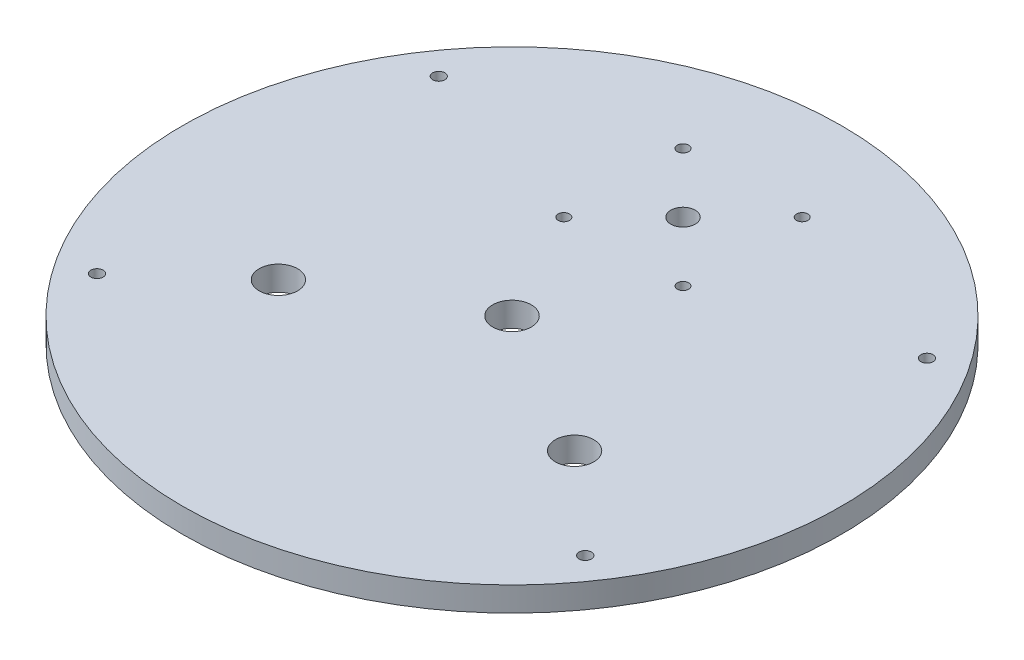
ISO-10303-21;
HEADER;
FILE_DESCRIPTION(('STEP AP214'),'2;1');
FILE_NAME('part.step','',(''),(''),'','','');
FILE_SCHEMA(('AUTOMOTIVE_DESIGN { 1 0 10303 214 1 1 1 1 }'));
ENDSEC;
DATA;
#1=APPLICATION_CONTEXT('core data for automotive mechanical design processes');
#2=APPLICATION_PROTOCOL_DEFINITION('international standard','automotive_design',2000,#1);
#3=PRODUCT_CONTEXT('',#1,'mechanical');
#4=PRODUCT('Part','Part','',(#3));
#5=PRODUCT_RELATED_PRODUCT_CATEGORY('part','',(#4));
#6=PRODUCT_DEFINITION_FORMATION('','',#4);
#7=PRODUCT_DEFINITION_CONTEXT('part definition',#1,'design');
#8=PRODUCT_DEFINITION('design','',#6,#7);
#9=PRODUCT_DEFINITION_SHAPE('','',#8);
#10=(LENGTH_UNIT() NAMED_UNIT(*) SI_UNIT(.MILLI.,.METRE.));
#11=(NAMED_UNIT(*) PLANE_ANGLE_UNIT() SI_UNIT($,.RADIAN.));
#12=(NAMED_UNIT(*) SI_UNIT($,.STERADIAN.) SOLID_ANGLE_UNIT());
#13=UNCERTAINTY_MEASURE_WITH_UNIT(LENGTH_MEASURE(1.E-05),#10,'distance_accuracy_value','');
#14=(GEOMETRIC_REPRESENTATION_CONTEXT(3) GLOBAL_UNCERTAINTY_ASSIGNED_CONTEXT((#13)) GLOBAL_UNIT_ASSIGNED_CONTEXT((#10,
#11,#12)) REPRESENTATION_CONTEXT('',''));
#15=CARTESIAN_POINT('',(0.,0.,0.));
#16=DIRECTION('',(0.,0.,1.));
#17=DIRECTION('',(1.,0.,0.));
#18=AXIS2_PLACEMENT_3D('',#15,#16,#17);
#19=CARTESIAN_POINT('',(0.,6.35,0.));
#20=DIRECTION('',(0.,-1.,0.));
#21=DIRECTION('',(0.,0.,-1.));
#22=AXIS2_PLACEMENT_3D('',#19,#20,#21);
#23=CYLINDRICAL_SURFACE('',#22,85.725);
#24=CARTESIAN_POINT('',(0.,6.35,0.));
#25=DIRECTION('',(0.,1.,0.));
#26=DIRECTION('',(0.,0.,1.));
#27=AXIS2_PLACEMENT_3D('',#24,#25,#26);
#28=CIRCLE('',#27,85.725);
#29=CARTESIAN_POINT('',(0.,6.35,85.725));
#30=VERTEX_POINT('',#29);
#31=EDGE_CURVE('E10',#30,#30,#28,.T.);
#32=ORIENTED_EDGE('',*,*,#31,.F.);
#33=EDGE_LOOP('',(#32));
#34=FACE_BOUND('',#33,.T.);
#35=CARTESIAN_POINT('',(0.,0.,0.));
#36=DIRECTION('',(0.,1.,0.));
#37=DIRECTION('',(0.,0.,1.));
#38=AXIS2_PLACEMENT_3D('',#35,#36,#37);
#39=CIRCLE('',#38,85.725);
#40=CARTESIAN_POINT('',(0.,0.,85.725));
#41=VERTEX_POINT('',#40);
#42=EDGE_CURVE('E36',#41,#41,#39,.T.);
#43=ORIENTED_EDGE('',*,*,#42,.T.);
#44=EDGE_LOOP('',(#43));
#45=FACE_BOUND('',#44,.T.);
#46=ADVANCED_FACE('F33',(#34,#45),#23,.T.);
#47=CARTESIAN_POINT('',(0.,6.35,0.));
#48=DIRECTION('',(0.,1.,0.));
#49=DIRECTION('',(0.,0.,1.));
#50=AXIS2_PLACEMENT_3D('',#47,#48,#49);
#51=PLANE('',#50);
#52=CARTESIAN_POINT('',(0.,6.35,0.));
#53=DIRECTION('',(0.,1.,0.));
#54=DIRECTION('',(0.,0.,1.));
#55=AXIS2_PLACEMENT_3D('',#52,#53,#54);
#56=CIRCLE('',#55,5.0165);
#57=CARTESIAN_POINT('',(0.,6.35,5.0165));
#58=VERTEX_POINT('',#57);
#59=EDGE_CURVE('E113',#58,#58,#56,.T.);
#60=ORIENTED_EDGE('',*,*,#59,.F.);
#61=EDGE_LOOP('',(#60));
#62=FACE_BOUND('',#61,.T.);
#63=CARTESIAN_POINT('',(15.50035,6.35,-59.982608));
#64=DIRECTION('',(0.,1.,0.));
#65=DIRECTION('',(0.,0.,1.));
#66=AXIS2_PLACEMENT_3D('',#63,#64,#65);
#67=CIRCLE('',#66,1.4732);
#68=CARTESIAN_POINT('',(15.50035,6.35,-58.509408));
#69=VERTEX_POINT('',#68);
#70=EDGE_CURVE('E96',#69,#69,#67,.T.);
#71=ORIENTED_EDGE('',*,*,#70,.F.);
#72=EDGE_LOOP('',(#71));
#73=FACE_BOUND('',#72,.T.);
#74=CARTESIAN_POINT('',(-15.50035,6.35,-28.981908));
#75=DIRECTION('',(0.,1.,0.));
#76=DIRECTION('',(0.,0.,1.));
#77=AXIS2_PLACEMENT_3D('',#74,#75,#76);
#78=CIRCLE('',#77,1.4732);
#79=CARTESIAN_POINT('',(-15.50035,6.35,-27.508708));
#80=VERTEX_POINT('',#79);
#81=EDGE_CURVE('E97',#80,#80,#78,.T.);
#82=ORIENTED_EDGE('',*,*,#81,.F.);
#83=EDGE_LOOP('',(#82));
#84=FACE_BOUND('',#83,.T.);
#85=CARTESIAN_POINT('',(15.50035,6.35,-28.981908));
#86=DIRECTION('',(0.,1.,0.));
#87=DIRECTION('',(0.,0.,1.));
#88=AXIS2_PLACEMENT_3D('',#85,#86,#87);
#89=CIRCLE('',#88,1.4732);
#90=CARTESIAN_POINT('',(15.50035,6.35,-27.508708));
#91=VERTEX_POINT('',#90);
#92=EDGE_CURVE('E107',#91,#91,#89,.T.);
#93=ORIENTED_EDGE('',*,*,#92,.F.);
#94=EDGE_LOOP('',(#93));
#95=FACE_BOUND('',#94,.T.);
#96=CARTESIAN_POINT('',(-15.50035,6.35,-59.982608));
#97=DIRECTION('',(0.,1.,0.));
#98=DIRECTION('',(0.,0.,1.));
#99=AXIS2_PLACEMENT_3D('',#96,#97,#98);
#100=CIRCLE('',#99,1.4732);
#101=CARTESIAN_POINT('',(-15.50035,6.35,-58.509408));
#102=VERTEX_POINT('',#101);
#103=EDGE_CURVE('E89',#102,#102,#100,.T.);
#104=ORIENTED_EDGE('',*,*,#103,.F.);
#105=EDGE_LOOP('',(#104));
#106=FACE_BOUND('',#105,.T.);
#107=CARTESIAN_POINT('',(38.5227654456936,6.35,22.2411289999999));
#108=DIRECTION('',(0.,1.,0.));
#109=DIRECTION('',(0.,0.,1.));
#110=AXIS2_PLACEMENT_3D('',#107,#108,#109);
#111=CIRCLE('',#110,5.);
#112=CARTESIAN_POINT('',(38.5227654456936,6.35,27.2411289999999));
#113=VERTEX_POINT('',#112);
#114=EDGE_CURVE('E80',#113,#113,#111,.T.);
#115=ORIENTED_EDGE('',*,*,#114,.F.);
#116=EDGE_LOOP('',(#115));
#117=FACE_BOUND('',#116,.T.);
#118=CARTESIAN_POINT('',(0.,6.35,-44.482258));
#119=DIRECTION('',(0.,1.,0.));
#120=DIRECTION('',(0.,0.,1.));
#121=AXIS2_PLACEMENT_3D('',#118,#119,#120);
#122=CIRCLE('',#121,3.17499999999999);
#123=CARTESIAN_POINT('',(0.,6.35,-41.307258));
#124=VERTEX_POINT('',#123);
#125=EDGE_CURVE('E77',#124,#124,#122,.T.);
#126=ORIENTED_EDGE('',*,*,#125,.F.);
#127=EDGE_LOOP('',(#126));
#128=FACE_BOUND('',#127,.T.);
#129=CARTESIAN_POINT('',(-38.5227654456936,6.35,22.2411289999999));
#130=DIRECTION('',(0.,1.,0.));
#131=DIRECTION('',(0.,0.,1.));
#132=AXIS2_PLACEMENT_3D('',#129,#130,#131);
#133=CIRCLE('',#132,5.);
#134=CARTESIAN_POINT('',(-38.5227654456936,6.35,27.2411289999999));
#135=VERTEX_POINT('',#134);
#136=EDGE_CURVE('E69',#135,#135,#133,.T.);
#137=ORIENTED_EDGE('',*,*,#136,.F.);
#138=EDGE_LOOP('',(#137));
#139=FACE_BOUND('',#138,.T.);
#140=CARTESIAN_POINT('',(63.5,6.35,-44.45));
#141=DIRECTION('',(0.,1.,0.));
#142=DIRECTION('',(0.,0.,1.));
#143=AXIS2_PLACEMENT_3D('',#140,#141,#142);
#144=CIRCLE('',#143,1.5875);
#145=CARTESIAN_POINT('',(63.5,6.35,-42.8625));
#146=VERTEX_POINT('',#145);
#147=EDGE_CURVE('E54',#146,#146,#144,.T.);
#148=ORIENTED_EDGE('',*,*,#147,.F.);
#149=EDGE_LOOP('',(#148));
#150=FACE_BOUND('',#149,.T.);
#151=CARTESIAN_POINT('',(-63.5,6.35,44.45));
#152=DIRECTION('',(0.,1.,0.));
#153=DIRECTION('',(0.,0.,1.));
#154=AXIS2_PLACEMENT_3D('',#151,#152,#153);
#155=CIRCLE('',#154,1.58749999999998);
#156=CARTESIAN_POINT('',(-63.5,6.35,46.0375));
#157=VERTEX_POINT('',#156);
#158=EDGE_CURVE('E55',#157,#157,#155,.T.);
#159=ORIENTED_EDGE('',*,*,#158,.F.);
#160=EDGE_LOOP('',(#159));
#161=FACE_BOUND('',#160,.T.);
#162=CARTESIAN_POINT('',(63.5,6.35,44.45));
#163=DIRECTION('',(0.,1.,0.));
#164=DIRECTION('',(0.,0.,1.));
#165=AXIS2_PLACEMENT_3D('',#162,#163,#164);
#166=CIRCLE('',#165,1.58749999999999);
#167=CARTESIAN_POINT('',(63.5,6.35,46.0375));
#168=VERTEX_POINT('',#167);
#169=EDGE_CURVE('E65',#168,#168,#166,.T.);
#170=ORIENTED_EDGE('',*,*,#169,.F.);
#171=EDGE_LOOP('',(#170));
#172=FACE_BOUND('',#171,.T.);
#173=CARTESIAN_POINT('',(-63.5,6.35,-44.45));
#174=DIRECTION('',(0.,1.,0.));
#175=DIRECTION('',(0.,0.,1.));
#176=AXIS2_PLACEMENT_3D('',#173,#174,#175);
#177=CIRCLE('',#176,1.58749999999996);
#178=CARTESIAN_POINT('',(-63.5,6.35,-42.8625));
#179=VERTEX_POINT('',#178);
#180=EDGE_CURVE('E47',#179,#179,#177,.T.);
#181=ORIENTED_EDGE('',*,*,#180,.F.);
#182=EDGE_LOOP('',(#181));
#183=FACE_BOUND('',#182,.T.);
#184=ORIENTED_EDGE('',*,*,#31,.T.);
#185=EDGE_LOOP('',(#184));
#186=FACE_BOUND('',#185,.T.);
#187=ADVANCED_FACE('F120',(#62,#73,#84,#95,#106,#117,#128,#139,#150,#161,#172,#183,#186),#51,.T.);
#188=CARTESIAN_POINT('',(0.,0.,0.));
#189=DIRECTION('',(0.,1.,0.));
#190=DIRECTION('',(0.,0.,1.));
#191=AXIS2_PLACEMENT_3D('',#188,#189,#190);
#192=PLANE('',#191);
#193=CARTESIAN_POINT('',(0.,0.,0.));
#194=DIRECTION('',(0.,1.,0.));
#195=DIRECTION('',(0.,0.,1.));
#196=AXIS2_PLACEMENT_3D('',#193,#194,#195);
#197=CIRCLE('',#196,5.0165);
#198=CARTESIAN_POINT('',(0.,0.,5.0165));
#199=VERTEX_POINT('',#198);
#200=EDGE_CURVE('E110',#199,#199,#197,.F.);
#201=ORIENTED_EDGE('',*,*,#200,.F.);
#202=EDGE_LOOP('',(#201));
#203=FACE_BOUND('',#202,.T.);
#204=CARTESIAN_POINT('',(15.50035,0.,-59.982608));
#205=DIRECTION('',(0.,1.,0.));
#206=DIRECTION('',(0.,0.,1.));
#207=AXIS2_PLACEMENT_3D('',#204,#205,#206);
#208=CIRCLE('',#207,1.4732);
#209=CARTESIAN_POINT('',(15.50035,0.,-58.509408));
#210=VERTEX_POINT('',#209);
#211=EDGE_CURVE('E92',#210,#210,#208,.F.);
#212=ORIENTED_EDGE('',*,*,#211,.F.);
#213=EDGE_LOOP('',(#212));
#214=FACE_BOUND('',#213,.T.);
#215=CARTESIAN_POINT('',(-15.50035,0.,-28.981908));
#216=DIRECTION('',(0.,1.,0.));
#217=DIRECTION('',(0.,0.,1.));
#218=AXIS2_PLACEMENT_3D('',#215,#216,#217);
#219=CIRCLE('',#218,1.4732);
#220=CARTESIAN_POINT('',(-15.50035,0.,-27.508708));
#221=VERTEX_POINT('',#220);
#222=EDGE_CURVE('E93',#221,#221,#219,.F.);
#223=ORIENTED_EDGE('',*,*,#222,.F.);
#224=EDGE_LOOP('',(#223));
#225=FACE_BOUND('',#224,.T.);
#226=CARTESIAN_POINT('',(15.50035,0.,-28.981908));
#227=DIRECTION('',(0.,1.,0.));
#228=DIRECTION('',(0.,0.,1.));
#229=AXIS2_PLACEMENT_3D('',#226,#227,#228);
#230=CIRCLE('',#229,1.4732);
#231=CARTESIAN_POINT('',(15.50035,0.,-27.508708));
#232=VERTEX_POINT('',#231);
#233=EDGE_CURVE('E100',#232,#232,#230,.F.);
#234=ORIENTED_EDGE('',*,*,#233,.F.);
#235=EDGE_LOOP('',(#234));
#236=FACE_BOUND('',#235,.T.);
#237=CARTESIAN_POINT('',(-15.50035,0.,-59.982608));
#238=DIRECTION('',(0.,1.,0.));
#239=DIRECTION('',(0.,0.,1.));
#240=AXIS2_PLACEMENT_3D('',#237,#238,#239);
#241=CIRCLE('',#240,1.4732);
#242=CARTESIAN_POINT('',(-15.50035,0.,-58.509408));
#243=VERTEX_POINT('',#242);
#244=EDGE_CURVE('E76',#243,#243,#241,.F.);
#245=ORIENTED_EDGE('',*,*,#244,.F.);
#246=EDGE_LOOP('',(#245));
#247=FACE_BOUND('',#246,.T.);
#248=CARTESIAN_POINT('',(38.5227654456936,0.,22.2411289999999));
#249=DIRECTION('',(0.,1.,0.));
#250=DIRECTION('',(0.,0.,1.));
#251=AXIS2_PLACEMENT_3D('',#248,#249,#250);
#252=CIRCLE('',#251,5.);
#253=CARTESIAN_POINT('',(38.5227654456936,0.,27.2411289999999));
#254=VERTEX_POINT('',#253);
#255=EDGE_CURVE('E68',#254,#254,#252,.F.);
#256=ORIENTED_EDGE('',*,*,#255,.F.);
#257=EDGE_LOOP('',(#256));
#258=FACE_BOUND('',#257,.T.);
#259=CARTESIAN_POINT('',(0.,0.,-44.482258));
#260=DIRECTION('',(0.,1.,0.));
#261=DIRECTION('',(0.,0.,1.));
#262=AXIS2_PLACEMENT_3D('',#259,#260,#261);
#263=CIRCLE('',#262,3.17499999999999);
#264=CARTESIAN_POINT('',(0.,0.,-41.307258));
#265=VERTEX_POINT('',#264);
#266=EDGE_CURVE('E72',#265,#265,#263,.F.);
#267=ORIENTED_EDGE('',*,*,#266,.F.);
#268=EDGE_LOOP('',(#267));
#269=FACE_BOUND('',#268,.T.);
#270=CARTESIAN_POINT('',(-38.5227654456936,0.,22.2411289999999));
#271=DIRECTION('',(0.,1.,0.));
#272=DIRECTION('',(0.,0.,1.));
#273=AXIS2_PLACEMENT_3D('',#270,#271,#272);
#274=CIRCLE('',#273,5.);
#275=CARTESIAN_POINT('',(-38.5227654456936,0.,27.2411289999999));
#276=VERTEX_POINT('',#275);
#277=EDGE_CURVE('E73',#276,#276,#274,.F.);
#278=ORIENTED_EDGE('',*,*,#277,.F.);
#279=EDGE_LOOP('',(#278));
#280=FACE_BOUND('',#279,.T.);
#281=CARTESIAN_POINT('',(63.5,0.,-44.45));
#282=DIRECTION('',(0.,1.,0.));
#283=DIRECTION('',(0.,0.,1.));
#284=AXIS2_PLACEMENT_3D('',#281,#282,#283);
#285=CIRCLE('',#284,1.5875);
#286=CARTESIAN_POINT('',(63.5,0.,-42.8625));
#287=VERTEX_POINT('',#286);
#288=EDGE_CURVE('E50',#287,#287,#285,.F.);
#289=ORIENTED_EDGE('',*,*,#288,.F.);
#290=EDGE_LOOP('',(#289));
#291=FACE_BOUND('',#290,.T.);
#292=CARTESIAN_POINT('',(-63.5,0.,44.45));
#293=DIRECTION('',(0.,1.,0.));
#294=DIRECTION('',(0.,0.,1.));
#295=AXIS2_PLACEMENT_3D('',#292,#293,#294);
#296=CIRCLE('',#295,1.58749999999998);
#297=CARTESIAN_POINT('',(-63.5,0.,46.0375));
#298=VERTEX_POINT('',#297);
#299=EDGE_CURVE('E51',#298,#298,#296,.F.);
#300=ORIENTED_EDGE('',*,*,#299,.F.);
#301=EDGE_LOOP('',(#300));
#302=FACE_BOUND('',#301,.T.);
#303=CARTESIAN_POINT('',(63.5,0.,44.45));
#304=DIRECTION('',(0.,1.,0.));
#305=DIRECTION('',(0.,0.,1.));
#306=AXIS2_PLACEMENT_3D('',#303,#304,#305);
#307=CIRCLE('',#306,1.58749999999999);
#308=CARTESIAN_POINT('',(63.5,0.,46.0375));
#309=VERTEX_POINT('',#308);
#310=EDGE_CURVE('E58',#309,#309,#307,.F.);
#311=ORIENTED_EDGE('',*,*,#310,.F.);
#312=EDGE_LOOP('',(#311));
#313=FACE_BOUND('',#312,.T.);
#314=CARTESIAN_POINT('',(-63.5,0.,-44.45));
#315=DIRECTION('',(0.,1.,0.));
#316=DIRECTION('',(0.,0.,1.));
#317=AXIS2_PLACEMENT_3D('',#314,#315,#316);
#318=CIRCLE('',#317,1.58749999999996);
#319=CARTESIAN_POINT('',(-63.5,0.,-42.8625));
#320=VERTEX_POINT('',#319);
#321=EDGE_CURVE('E43',#320,#320,#318,.F.);
#322=ORIENTED_EDGE('',*,*,#321,.F.);
#323=EDGE_LOOP('',(#322));
#324=FACE_BOUND('',#323,.T.);
#325=ORIENTED_EDGE('',*,*,#42,.F.);
#326=EDGE_LOOP('',(#325));
#327=FACE_BOUND('',#326,.T.);
#328=ADVANCED_FACE('F123',(#203,#214,#225,#236,#247,#258,#269,#280,#291,#302,#313,#324,#327),
#192,.F.);
#329=CARTESIAN_POINT('',(-63.5,-0.00100000000000013,-44.45));
#330=DIRECTION('',(0.,1.,0.));
#331=DIRECTION('',(0.,0.,1.));
#332=AXIS2_PLACEMENT_3D('',#329,#330,#331);
#333=CYLINDRICAL_SURFACE('',#332,1.58749999999996);
#334=ORIENTED_EDGE('',*,*,#180,.T.);
#335=EDGE_LOOP('',(#334));
#336=FACE_BOUND('',#335,.T.);
#337=ORIENTED_EDGE('',*,*,#321,.T.);
#338=EDGE_LOOP('',(#337));
#339=FACE_BOUND('',#338,.T.);
#340=ADVANCED_FACE('F147',(#336,#339),#333,.F.);
#341=CARTESIAN_POINT('',(63.5,-0.00100000000000013,44.45));
#342=DIRECTION('',(0.,1.,0.));
#343=DIRECTION('',(0.,0.,1.));
#344=AXIS2_PLACEMENT_3D('',#341,#342,#343);
#345=CYLINDRICAL_SURFACE('',#344,1.58749999999999);
#346=ORIENTED_EDGE('',*,*,#169,.T.);
#347=EDGE_LOOP('',(#346));
#348=FACE_BOUND('',#347,.T.);
#349=ORIENTED_EDGE('',*,*,#310,.T.);
#350=EDGE_LOOP('',(#349));
#351=FACE_BOUND('',#350,.T.);
#352=ADVANCED_FACE('F150',(#348,#351),#345,.F.);
#353=CARTESIAN_POINT('',(-63.5,-0.00100000000000013,44.45));
#354=DIRECTION('',(0.,1.,0.));
#355=DIRECTION('',(0.,0.,1.));
#356=AXIS2_PLACEMENT_3D('',#353,#354,#355);
#357=CYLINDRICAL_SURFACE('',#356,1.58749999999998);
#358=ORIENTED_EDGE('',*,*,#158,.T.);
#359=EDGE_LOOP('',(#358));
#360=FACE_BOUND('',#359,.T.);
#361=ORIENTED_EDGE('',*,*,#299,.T.);
#362=EDGE_LOOP('',(#361));
#363=FACE_BOUND('',#362,.T.);
#364=ADVANCED_FACE('F183',(#360,#363),#357,.F.);
#365=CARTESIAN_POINT('',(63.5,-0.00100000000000013,-44.45));
#366=DIRECTION('',(0.,1.,0.));
#367=DIRECTION('',(0.,0.,1.));
#368=AXIS2_PLACEMENT_3D('',#365,#366,#367);
#369=CYLINDRICAL_SURFACE('',#368,1.5875);
#370=ORIENTED_EDGE('',*,*,#147,.T.);
#371=EDGE_LOOP('',(#370));
#372=FACE_BOUND('',#371,.T.);
#373=ORIENTED_EDGE('',*,*,#288,.T.);
#374=EDGE_LOOP('',(#373));
#375=FACE_BOUND('',#374,.T.);
#376=ADVANCED_FACE('F191',(#372,#375),#369,.F.);
#377=CARTESIAN_POINT('',(-38.5227654456936,-0.00100000000000013,22.2411289999999));
#378=DIRECTION('',(0.,1.,0.));
#379=DIRECTION('',(0.,0.,1.));
#380=AXIS2_PLACEMENT_3D('',#377,#378,#379);
#381=CYLINDRICAL_SURFACE('',#380,5.);
#382=ORIENTED_EDGE('',*,*,#136,.T.);
#383=EDGE_LOOP('',(#382));
#384=FACE_BOUND('',#383,.T.);
#385=ORIENTED_EDGE('',*,*,#277,.T.);
#386=EDGE_LOOP('',(#385));
#387=FACE_BOUND('',#386,.T.);
#388=ADVANCED_FACE('F199',(#384,#387),#381,.F.);
#389=CARTESIAN_POINT('',(0.,-0.00100000000000013,-44.482258));
#390=DIRECTION('',(0.,1.,0.));
#391=DIRECTION('',(0.,0.,1.));
#392=AXIS2_PLACEMENT_3D('',#389,#390,#391);
#393=CYLINDRICAL_SURFACE('',#392,3.17499999999999);
#394=ORIENTED_EDGE('',*,*,#125,.T.);
#395=EDGE_LOOP('',(#394));
#396=FACE_BOUND('',#395,.T.);
#397=ORIENTED_EDGE('',*,*,#266,.T.);
#398=EDGE_LOOP('',(#397));
#399=FACE_BOUND('',#398,.T.);
#400=ADVANCED_FACE('F207',(#396,#399),#393,.F.);
#401=CARTESIAN_POINT('',(38.5227654456936,-0.00100000000000013,22.2411289999999));
#402=DIRECTION('',(0.,1.,0.));
#403=DIRECTION('',(0.,0.,1.));
#404=AXIS2_PLACEMENT_3D('',#401,#402,#403);
#405=CYLINDRICAL_SURFACE('',#404,5.);
#406=ORIENTED_EDGE('',*,*,#114,.T.);
#407=EDGE_LOOP('',(#406));
#408=FACE_BOUND('',#407,.T.);
#409=ORIENTED_EDGE('',*,*,#255,.T.);
#410=EDGE_LOOP('',(#409));
#411=FACE_BOUND('',#410,.T.);
#412=ADVANCED_FACE('F215',(#408,#411),#405,.F.);
#413=CARTESIAN_POINT('',(-15.50035,-0.00100000000000013,-59.982608));
#414=DIRECTION('',(0.,1.,0.));
#415=DIRECTION('',(0.,0.,1.));
#416=AXIS2_PLACEMENT_3D('',#413,#414,#415);
#417=CYLINDRICAL_SURFACE('',#416,1.4732);
#418=ORIENTED_EDGE('',*,*,#103,.T.);
#419=EDGE_LOOP('',(#418));
#420=FACE_BOUND('',#419,.T.);
#421=ORIENTED_EDGE('',*,*,#244,.T.);
#422=EDGE_LOOP('',(#421));
#423=FACE_BOUND('',#422,.T.);
#424=ADVANCED_FACE('F223',(#420,#423),#417,.F.);
#425=CARTESIAN_POINT('',(15.50035,-0.00100000000000013,-28.981908));
#426=DIRECTION('',(0.,1.,0.));
#427=DIRECTION('',(0.,0.,1.));
#428=AXIS2_PLACEMENT_3D('',#425,#426,#427);
#429=CYLINDRICAL_SURFACE('',#428,1.4732);
#430=ORIENTED_EDGE('',*,*,#92,.T.);
#431=EDGE_LOOP('',(#430));
#432=FACE_BOUND('',#431,.T.);
#433=ORIENTED_EDGE('',*,*,#233,.T.);
#434=EDGE_LOOP('',(#433));
#435=FACE_BOUND('',#434,.T.);
#436=ADVANCED_FACE('F231',(#432,#435),#429,.F.);
#437=CARTESIAN_POINT('',(-15.50035,-0.00100000000000013,-28.981908));
#438=DIRECTION('',(0.,1.,0.));
#439=DIRECTION('',(0.,0.,1.));
#440=AXIS2_PLACEMENT_3D('',#437,#438,#439);
#441=CYLINDRICAL_SURFACE('',#440,1.4732);
#442=ORIENTED_EDGE('',*,*,#81,.T.);
#443=EDGE_LOOP('',(#442));
#444=FACE_BOUND('',#443,.T.);
#445=ORIENTED_EDGE('',*,*,#222,.T.);
#446=EDGE_LOOP('',(#445));
#447=FACE_BOUND('',#446,.T.);
#448=ADVANCED_FACE('F239',(#444,#447),#441,.F.);
#449=CARTESIAN_POINT('',(15.50035,-0.00100000000000013,-59.982608));
#450=DIRECTION('',(0.,1.,0.));
#451=DIRECTION('',(0.,0.,1.));
#452=AXIS2_PLACEMENT_3D('',#449,#450,#451);
#453=CYLINDRICAL_SURFACE('',#452,1.4732);
#454=ORIENTED_EDGE('',*,*,#70,.T.);
#455=EDGE_LOOP('',(#454));
#456=FACE_BOUND('',#455,.T.);
#457=ORIENTED_EDGE('',*,*,#211,.T.);
#458=EDGE_LOOP('',(#457));
#459=FACE_BOUND('',#458,.T.);
#460=ADVANCED_FACE('F247',(#456,#459),#453,.F.);
#461=CARTESIAN_POINT('',(0.,-0.00100000000000013,0.));
#462=DIRECTION('',(0.,1.,0.));
#463=DIRECTION('',(0.,0.,1.));
#464=AXIS2_PLACEMENT_3D('',#461,#462,#463);
#465=CYLINDRICAL_SURFACE('',#464,5.0165);
#466=ORIENTED_EDGE('',*,*,#59,.T.);
#467=EDGE_LOOP('',(#466));
#468=FACE_BOUND('',#467,.T.);
#469=ORIENTED_EDGE('',*,*,#200,.T.);
#470=EDGE_LOOP('',(#469));
#471=FACE_BOUND('',#470,.T.);
#472=ADVANCED_FACE('F117',(#468,#471),#465,.F.);
#473=CLOSED_SHELL('',(#46,#187,#328,#340,#352,#364,#376,#388,#400,#412,#424,#436,#448,#460,#472));
#474=MANIFOLD_SOLID_BREP('B2',#473);
#475=ADVANCED_BREP_SHAPE_REPRESENTATION('',(#18,#474),#14);
#476=SHAPE_DEFINITION_REPRESENTATION(#9,#475);
ENDSEC;
END-ISO-10303-21;
